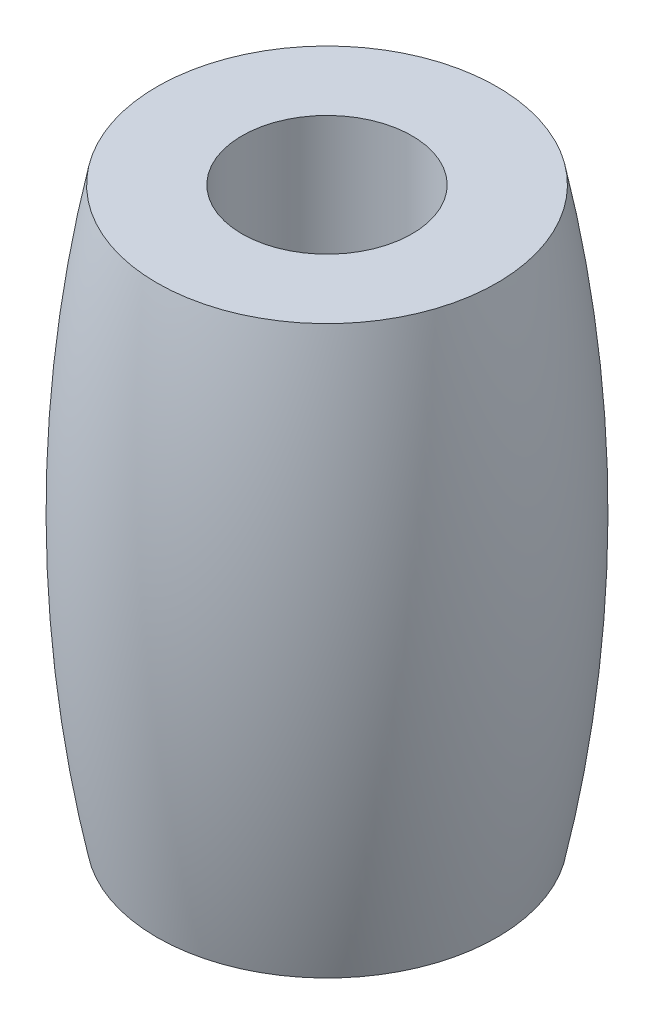
ISO-10303-21;
HEADER;
FILE_DESCRIPTION(('STEP AP214'),'2;1');
FILE_NAME('part.step','',(''),(''),'','','');
FILE_SCHEMA(('AUTOMOTIVE_DESIGN { 1 0 10303 214 1 1 1 1 }'));
ENDSEC;
DATA;
#1=APPLICATION_CONTEXT('core data for automotive mechanical design processes');
#2=APPLICATION_PROTOCOL_DEFINITION('international standard','automotive_design',2000,#1);
#3=PRODUCT_CONTEXT('',#1,'mechanical');
#4=PRODUCT('Part','Part','',(#3));
#5=PRODUCT_RELATED_PRODUCT_CATEGORY('part','',(#4));
#6=PRODUCT_DEFINITION_FORMATION('','',#4);
#7=PRODUCT_DEFINITION_CONTEXT('part definition',#1,'design');
#8=PRODUCT_DEFINITION('design','',#6,#7);
#9=PRODUCT_DEFINITION_SHAPE('','',#8);
#10=(LENGTH_UNIT() NAMED_UNIT(*) SI_UNIT(.MILLI.,.METRE.));
#11=(NAMED_UNIT(*) PLANE_ANGLE_UNIT() SI_UNIT($,.RADIAN.));
#12=(NAMED_UNIT(*) SI_UNIT($,.STERADIAN.) SOLID_ANGLE_UNIT());
#13=UNCERTAINTY_MEASURE_WITH_UNIT(LENGTH_MEASURE(1.E-05),#10,'distance_accuracy_value','');
#14=(GEOMETRIC_REPRESENTATION_CONTEXT(3) GLOBAL_UNCERTAINTY_ASSIGNED_CONTEXT((#13)) GLOBAL_UNIT_ASSIGNED_CONTEXT((#10,
#11,#12)) REPRESENTATION_CONTEXT('',''));
#15=CARTESIAN_POINT('',(0.,0.,0.));
#16=DIRECTION('',(0.,0.,1.));
#17=DIRECTION('',(1.,0.,0.));
#18=AXIS2_PLACEMENT_3D('',#15,#16,#17);
#19=CARTESIAN_POINT('',(0.,0.,0.));
#20=DIRECTION('',(0.,1.,0.));
#21=DIRECTION('',(0.,0.,1.));
#22=AXIS2_PLACEMENT_3D('',#19,#20,#21);
#23=PLANE('',#22);
#24=CARTESIAN_POINT('',(0.,0.,0.));
#25=DIRECTION('',(0.,1.,0.));
#26=DIRECTION('',(0.,0.,1.));
#27=AXIS2_PLACEMENT_3D('',#24,#25,#26);
#28=CIRCLE('',#27,1.5);
#29=CARTESIAN_POINT('',(0.,0.,1.5));
#30=VERTEX_POINT('',#29);
#31=EDGE_CURVE('E41',#30,#30,#28,.T.);
#32=ORIENTED_EDGE('',*,*,#31,.T.);
#33=EDGE_LOOP('',(#32));
#34=FACE_BOUND('',#33,.T.);
#35=CARTESIAN_POINT('',(0.,0.,0.));
#36=DIRECTION('',(0.,1.,0.));
#37=DIRECTION('',(0.,0.,1.));
#38=AXIS2_PLACEMENT_3D('',#35,#36,#37);
#39=CIRCLE('',#38,3.);
#40=CARTESIAN_POINT('',(0.,0.,3.));
#41=VERTEX_POINT('',#40);
#42=EDGE_CURVE('E10',#41,#41,#39,.T.);
#43=ORIENTED_EDGE('',*,*,#42,.F.);
#44=EDGE_LOOP('',(#43));
#45=FACE_BOUND('',#44,.T.);
#46=ADVANCED_FACE('F31',(#34,#45),#23,.F.);
#47=CARTESIAN_POINT('',(0.,5.,0.));
#48=DIRECTION('',(0.,1.,0.));
#49=DIRECTION('',(0.,0.,1.));
#50=AXIS2_PLACEMENT_3D('',#47,#48,#49);
#51=DEGENERATE_TOROIDAL_SURFACE('',#50,21.4948974278318,25.,.F.);
#52=CARTESIAN_POINT('',(0.,10.,0.));
#53=DIRECTION('',(0.,1.,0.));
#54=DIRECTION('',(0.,0.,1.));
#55=AXIS2_PLACEMENT_3D('',#52,#53,#54);
#56=CIRCLE('',#55,3.);
#57=CARTESIAN_POINT('',(0.,10.,3.));
#58=VERTEX_POINT('',#57);
#59=EDGE_CURVE('E37',#58,#58,#56,.T.);
#60=ORIENTED_EDGE('',*,*,#59,.F.);
#61=EDGE_LOOP('',(#60));
#62=FACE_BOUND('',#61,.T.);
#63=ORIENTED_EDGE('',*,*,#42,.T.);
#64=EDGE_LOOP('',(#63));
#65=FACE_BOUND('',#64,.T.);
#66=ADVANCED_FACE('F55',(#62,#65),#51,.F.);
#67=CARTESIAN_POINT('',(3.,10.,0.));
#68=DIRECTION('',(0.,-1.,0.));
#69=DIRECTION('',(0.,0.,-1.));
#70=AXIS2_PLACEMENT_3D('',#67,#68,#69);
#71=PLANE('',#70);
#72=CARTESIAN_POINT('',(0.,10.,0.));
#73=DIRECTION('',(0.,1.,0.));
#74=DIRECTION('',(0.,0.,1.));
#75=AXIS2_PLACEMENT_3D('',#72,#73,#74);
#76=CIRCLE('',#75,1.5);
#77=CARTESIAN_POINT('',(0.,10.,1.5));
#78=VERTEX_POINT('',#77);
#79=EDGE_CURVE('E45',#78,#78,#76,.T.);
#80=ORIENTED_EDGE('',*,*,#79,.F.);
#81=EDGE_LOOP('',(#80));
#82=FACE_BOUND('',#81,.T.);
#83=ORIENTED_EDGE('',*,*,#59,.T.);
#84=EDGE_LOOP('',(#83));
#85=FACE_BOUND('',#84,.T.);
#86=ADVANCED_FACE('F53',(#82,#85),#71,.F.);
#87=CARTESIAN_POINT('',(0.,0.,0.));
#88=DIRECTION('',(0.,1.,0.));
#89=DIRECTION('',(0.,0.,1.));
#90=AXIS2_PLACEMENT_3D('',#87,#88,#89);
#91=CYLINDRICAL_SURFACE('',#90,1.5);
#92=ORIENTED_EDGE('',*,*,#31,.F.);
#93=EDGE_LOOP('',(#92));
#94=FACE_BOUND('',#93,.T.);
#95=ORIENTED_EDGE('',*,*,#79,.T.);
#96=EDGE_LOOP('',(#95));
#97=FACE_BOUND('',#96,.T.);
#98=ADVANCED_FACE('F51',(#94,#97),#91,.F.);
#99=CLOSED_SHELL('',(#46,#66,#86,#98));
#100=MANIFOLD_SOLID_BREP('B2',#99);
#101=ADVANCED_BREP_SHAPE_REPRESENTATION('',(#18,#100),#14);
#102=SHAPE_DEFINITION_REPRESENTATION(#9,#101);
ENDSEC;
END-ISO-10303-21;
